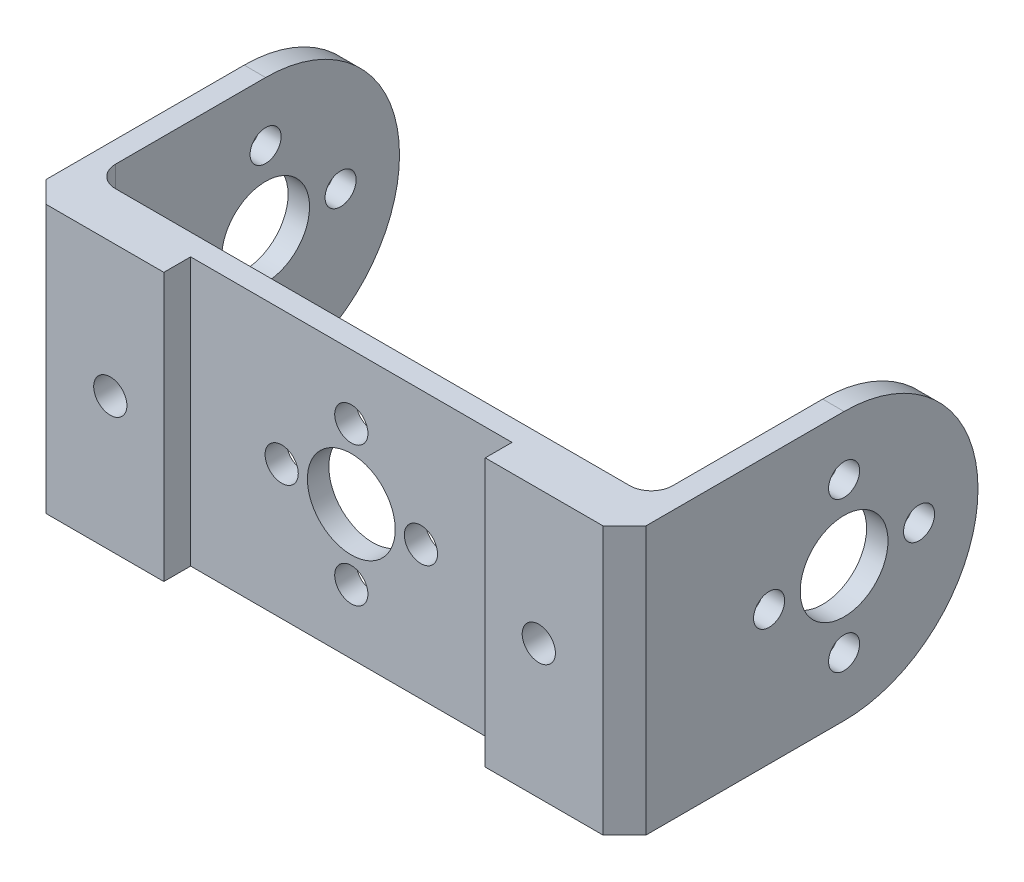
ISO-10303-21;
HEADER;
FILE_DESCRIPTION(('STEP AP214'),'2;1');
FILE_NAME('part.step','',(''),(''),'','','');
FILE_SCHEMA(('AUTOMOTIVE_DESIGN { 1 0 10303 214 1 1 1 1 }'));
ENDSEC;
DATA;
#1=APPLICATION_CONTEXT('core data for automotive mechanical design processes');
#2=APPLICATION_PROTOCOL_DEFINITION('international standard','automotive_design',2000,#1);
#3=PRODUCT_CONTEXT('',#1,'mechanical');
#4=PRODUCT('Part','Part','',(#3));
#5=PRODUCT_RELATED_PRODUCT_CATEGORY('part','',(#4));
#6=PRODUCT_DEFINITION_FORMATION('','',#4);
#7=PRODUCT_DEFINITION_CONTEXT('part definition',#1,'design');
#8=PRODUCT_DEFINITION('design','',#6,#7);
#9=PRODUCT_DEFINITION_SHAPE('','',#8);
#10=(LENGTH_UNIT() NAMED_UNIT(*) SI_UNIT(.MILLI.,.METRE.));
#11=(NAMED_UNIT(*) PLANE_ANGLE_UNIT() SI_UNIT($,.RADIAN.));
#12=(NAMED_UNIT(*) SI_UNIT($,.STERADIAN.) SOLID_ANGLE_UNIT());
#13=UNCERTAINTY_MEASURE_WITH_UNIT(LENGTH_MEASURE(1.E-05),#10,'distance_accuracy_value','');
#14=(GEOMETRIC_REPRESENTATION_CONTEXT(3) GLOBAL_UNCERTAINTY_ASSIGNED_CONTEXT((#13)) GLOBAL_UNIT_ASSIGNED_CONTEXT((#10,
#11,#12)) REPRESENTATION_CONTEXT('',''));
#15=CARTESIAN_POINT('',(0.,0.,0.));
#16=DIRECTION('',(0.,0.,1.));
#17=DIRECTION('',(1.,0.,0.));
#18=AXIS2_PLACEMENT_3D('',#15,#16,#17);
#19=CARTESIAN_POINT('',(0.,0.,2.));
#20=DIRECTION('',(0.,0.,-1.));
#21=DIRECTION('',(-1.,0.,0.));
#22=AXIS2_PLACEMENT_3D('',#19,#20,#21);
#23=PLANE('',#22);
#24=CARTESIAN_POINT('',(0.,6.49999999999998,2.));
#25=DIRECTION('',(0.,0.,1.));
#26=DIRECTION('',(1.,0.,0.));
#27=AXIS2_PLACEMENT_3D('',#24,#25,#26);
#28=CIRCLE('',#27,1.55000000000001);
#29=CARTESIAN_POINT('',(1.55000000000001,6.49999999999998,2.));
#30=VERTEX_POINT('',#29);
#31=EDGE_CURVE('E211',#30,#30,#28,.T.);
#32=ORIENTED_EDGE('',*,*,#31,.F.);
#33=EDGE_LOOP('',(#32));
#34=FACE_BOUND('',#33,.T.);
#35=CARTESIAN_POINT('',(-6.49999999999999,0.,2.));
#36=DIRECTION('',(0.,0.,1.));
#37=DIRECTION('',(1.,0.,0.));
#38=AXIS2_PLACEMENT_3D('',#35,#36,#37);
#39=CIRCLE('',#38,1.54999999999998);
#40=CARTESIAN_POINT('',(-4.95000000000001,0.,2.));
#41=VERTEX_POINT('',#40);
#42=EDGE_CURVE('E230',#41,#41,#39,.T.);
#43=ORIENTED_EDGE('',*,*,#42,.F.);
#44=EDGE_LOOP('',(#43));
#45=FACE_BOUND('',#44,.T.);
#46=CARTESIAN_POINT('',(6.50000000000001,0.,2.));
#47=DIRECTION('',(0.,0.,1.));
#48=DIRECTION('',(1.,0.,0.));
#49=AXIS2_PLACEMENT_3D('',#46,#47,#48);
#50=CIRCLE('',#49,1.54999999999998);
#51=CARTESIAN_POINT('',(8.04999999999999,0.,2.));
#52=VERTEX_POINT('',#51);
#53=EDGE_CURVE('E219',#52,#52,#50,.T.);
#54=ORIENTED_EDGE('',*,*,#53,.F.);
#55=EDGE_LOOP('',(#54));
#56=FACE_BOUND('',#55,.T.);
#57=CARTESIAN_POINT('',(0.,-6.5,2.));
#58=DIRECTION('',(0.,0.,1.));
#59=DIRECTION('',(1.,0.,0.));
#60=AXIS2_PLACEMENT_3D('',#57,#58,#59);
#61=CIRCLE('',#60,1.55000000000001);
#62=CARTESIAN_POINT('',(1.55000000000001,-6.5,2.));
#63=VERTEX_POINT('',#62);
#64=EDGE_CURVE('E220',#63,#63,#61,.T.);
#65=ORIENTED_EDGE('',*,*,#64,.F.);
#66=EDGE_LOOP('',(#65));
#67=FACE_BOUND('',#66,.T.);
#68=CARTESIAN_POINT('',(0.,0.,2.));
#69=DIRECTION('',(0.,0.,1.));
#70=DIRECTION('',(1.,0.,0.));
#71=AXIS2_PLACEMENT_3D('',#68,#69,#70);
#72=CIRCLE('',#71,4.09999999999999);
#73=CARTESIAN_POINT('',(4.09999999999999,0.,2.));
#74=VERTEX_POINT('',#73);
#75=EDGE_CURVE('E210',#74,#74,#72,.T.);
#76=ORIENTED_EDGE('',*,*,#75,.F.);
#77=EDGE_LOOP('',(#76));
#78=FACE_BOUND('',#77,.T.);
#79=DIRECTION('',(0.,-1.,0.));
#80=VECTOR('',#79,1.);
#81=CARTESIAN_POINT('',(15.,12.5,2.));
#82=LINE('',#81,#80);
#83=CARTESIAN_POINT('',(15.,12.5,2.));
#84=VERTEX_POINT('',#83);
#85=CARTESIAN_POINT('',(15.,-12.5,2.));
#86=VERTEX_POINT('',#85);
#87=EDGE_CURVE('E163',#84,#86,#82,.T.);
#88=ORIENTED_EDGE('',*,*,#87,.F.);
#89=DIRECTION('',(-1.,0.,0.));
#90=VECTOR('',#89,1.);
#91=CARTESIAN_POINT('',(-28.,12.5,2.));
#92=LINE('',#91,#90);
#93=CARTESIAN_POINT('',(-15.,12.5,2.));
#94=VERTEX_POINT('',#93);
#95=EDGE_CURVE('E178',#84,#94,#92,.T.);
#96=ORIENTED_EDGE('',*,*,#95,.T.);
#97=DIRECTION('',(0.,1.,0.));
#98=VECTOR('',#97,1.);
#99=CARTESIAN_POINT('',(-15.,12.5,2.));
#100=LINE('',#99,#98);
#101=CARTESIAN_POINT('',(-15.,-12.5,2.));
#102=VERTEX_POINT('',#101);
#103=EDGE_CURVE('E182',#102,#94,#100,.T.);
#104=ORIENTED_EDGE('',*,*,#103,.F.);
#105=DIRECTION('',(1.,0.,0.));
#106=VECTOR('',#105,1.);
#107=CARTESIAN_POINT('',(-28.,-12.5,2.));
#108=LINE('',#107,#106);
#109=EDGE_CURVE('E333',#102,#86,#108,.T.);
#110=ORIENTED_EDGE('',*,*,#109,.T.);
#111=EDGE_LOOP('',(#88,#96,#104,#110));
#112=FACE_BOUND('',#111,.T.);
#113=ADVANCED_FACE('F39',(#34,#45,#56,#67,#78,#112),#23,.F.);
#114=CARTESIAN_POINT('',(0.,0.,0.));
#115=DIRECTION('',(0.,0.,-1.));
#116=DIRECTION('',(-1.,0.,0.));
#117=AXIS2_PLACEMENT_3D('',#114,#115,#116);
#118=PLANE('',#117);
#119=CARTESIAN_POINT('',(-20.,0.,0.));
#120=DIRECTION('',(0.,0.,1.));
#121=DIRECTION('',(1.,0.,0.));
#122=AXIS2_PLACEMENT_3D('',#119,#120,#121);
#123=CIRCLE('',#122,1.54999999999998);
#124=CARTESIAN_POINT('',(-18.45,0.,0.));
#125=VERTEX_POINT('',#124);
#126=EDGE_CURVE('E202',#125,#125,#123,.T.);
#127=ORIENTED_EDGE('',*,*,#126,.T.);
#128=EDGE_LOOP('',(#127));
#129=FACE_BOUND('',#128,.T.);
#130=CARTESIAN_POINT('',(20.,0.,0.));
#131=DIRECTION('',(0.,0.,1.));
#132=DIRECTION('',(1.,0.,0.));
#133=AXIS2_PLACEMENT_3D('',#130,#131,#132);
#134=CIRCLE('',#133,1.54999999999998);
#135=CARTESIAN_POINT('',(21.55,0.,0.));
#136=VERTEX_POINT('',#135);
#137=EDGE_CURVE('E201',#136,#136,#134,.T.);
#138=ORIENTED_EDGE('',*,*,#137,.T.);
#139=EDGE_LOOP('',(#138));
#140=FACE_BOUND('',#139,.T.);
#141=CARTESIAN_POINT('',(0.,6.49999999999998,0.));
#142=DIRECTION('',(0.,0.,1.));
#143=DIRECTION('',(1.,0.,0.));
#144=AXIS2_PLACEMENT_3D('',#141,#142,#143);
#145=CIRCLE('',#144,1.55000000000001);
#146=CARTESIAN_POINT('',(1.55000000000001,6.49999999999998,0.));
#147=VERTEX_POINT('',#146);
#148=EDGE_CURVE('E207',#147,#147,#145,.T.);
#149=ORIENTED_EDGE('',*,*,#148,.T.);
#150=EDGE_LOOP('',(#149));
#151=FACE_BOUND('',#150,.T.);
#152=CARTESIAN_POINT('',(-6.49999999999999,0.,0.));
#153=DIRECTION('',(0.,0.,1.));
#154=DIRECTION('',(1.,0.,0.));
#155=AXIS2_PLACEMENT_3D('',#152,#153,#154);
#156=CIRCLE('',#155,1.54999999999998);
#157=CARTESIAN_POINT('',(-4.95000000000001,0.,0.));
#158=VERTEX_POINT('',#157);
#159=EDGE_CURVE('E206',#158,#158,#156,.T.);
#160=ORIENTED_EDGE('',*,*,#159,.T.);
#161=EDGE_LOOP('',(#160));
#162=FACE_BOUND('',#161,.T.);
#163=CARTESIAN_POINT('',(6.50000000000001,0.,0.));
#164=DIRECTION('',(0.,0.,1.));
#165=DIRECTION('',(1.,0.,0.));
#166=AXIS2_PLACEMENT_3D('',#163,#164,#165);
#167=CIRCLE('',#166,1.54999999999998);
#168=CARTESIAN_POINT('',(8.04999999999999,0.,0.));
#169=VERTEX_POINT('',#168);
#170=EDGE_CURVE('E233',#169,#169,#167,.T.);
#171=ORIENTED_EDGE('',*,*,#170,.T.);
#172=EDGE_LOOP('',(#171));
#173=FACE_BOUND('',#172,.T.);
#174=CARTESIAN_POINT('',(0.,-6.5,0.));
#175=DIRECTION('',(0.,0.,1.));
#176=DIRECTION('',(1.,0.,0.));
#177=AXIS2_PLACEMENT_3D('',#174,#175,#176);
#178=CIRCLE('',#177,1.55000000000001);
#179=CARTESIAN_POINT('',(1.55000000000001,-6.5,0.));
#180=VERTEX_POINT('',#179);
#181=EDGE_CURVE('E216',#180,#180,#178,.T.);
#182=ORIENTED_EDGE('',*,*,#181,.T.);
#183=EDGE_LOOP('',(#182));
#184=FACE_BOUND('',#183,.T.);
#185=CARTESIAN_POINT('',(0.,0.,0.));
#186=DIRECTION('',(0.,0.,1.));
#187=DIRECTION('',(1.,0.,0.));
#188=AXIS2_PLACEMENT_3D('',#185,#186,#187);
#189=CIRCLE('',#188,4.09999999999999);
#190=CARTESIAN_POINT('',(4.09999999999999,0.,0.));
#191=VERTEX_POINT('',#190);
#192=EDGE_CURVE('E223',#191,#191,#189,.T.);
#193=ORIENTED_EDGE('',*,*,#192,.T.);
#194=EDGE_LOOP('',(#193));
#195=FACE_BOUND('',#194,.T.);
#196=DIRECTION('',(-1.,0.,0.));
#197=VECTOR('',#196,1.);
#198=CARTESIAN_POINT('',(-28.,12.5,0.));
#199=LINE('',#198,#197);
#200=CARTESIAN_POINT('',(24.,12.5,0.));
#201=VERTEX_POINT('',#200);
#202=CARTESIAN_POINT('',(-24.,12.5,0.));
#203=VERTEX_POINT('',#202);
#204=EDGE_CURVE('E329',#201,#203,#199,.T.);
#205=ORIENTED_EDGE('',*,*,#204,.F.);
#206=DIRECTION('',(0.,1.,0.));
#207=VECTOR('',#206,1.);
#208=CARTESIAN_POINT('',(24.,0.,0.));
#209=LINE('',#208,#207);
#210=CARTESIAN_POINT('',(24.,-12.5,0.));
#211=VERTEX_POINT('',#210);
#212=EDGE_CURVE('E354',#201,#211,#209,.F.);
#213=ORIENTED_EDGE('',*,*,#212,.T.);
#214=DIRECTION('',(1.,0.,0.));
#215=VECTOR('',#214,1.);
#216=CARTESIAN_POINT('',(-28.,-12.5,0.));
#217=LINE('',#216,#215);
#218=CARTESIAN_POINT('',(-24.,-12.5,0.));
#219=VERTEX_POINT('',#218);
#220=EDGE_CURVE('E334',#219,#211,#217,.T.);
#221=ORIENTED_EDGE('',*,*,#220,.F.);
#222=DIRECTION('',(0.,1.,0.));
#223=VECTOR('',#222,1.);
#224=CARTESIAN_POINT('',(-24.,0.,0.));
#225=LINE('',#224,#223);
#226=EDGE_CURVE('E351',#219,#203,#225,.T.);
#227=ORIENTED_EDGE('',*,*,#226,.T.);
#228=EDGE_LOOP('',(#205,#213,#221,#227));
#229=FACE_BOUND('',#228,.T.);
#230=ADVANCED_FACE('F410',(#129,#140,#151,#162,#173,#184,#195,#229),#118,.T.);
#231=CARTESIAN_POINT('',(28.,-12.5,2.));
#232=DIRECTION('',(-1.,0.,0.));
#233=DIRECTION('',(0.,0.,1.));
#234=AXIS2_PLACEMENT_3D('',#231,#232,#233);
#235=PLANE('',#234);
#236=DIRECTION('',(0.,0.,-1.));
#237=VECTOR('',#236,1.);
#238=CARTESIAN_POINT('',(28.,12.5,2.));
#239=LINE('',#238,#237);
#240=CARTESIAN_POINT('',(28.,12.5,2.49999999999999));
#241=VERTEX_POINT('',#240);
#242=CARTESIAN_POINT('',(28.,12.5,-16.));
#243=VERTEX_POINT('',#242);
#244=EDGE_CURVE('E346',#241,#243,#239,.T.);
#245=ORIENTED_EDGE('',*,*,#244,.F.);
#246=DIRECTION('',(0.,-1.,0.));
#247=VECTOR('',#246,1.);
#248=CARTESIAN_POINT('',(28.,-12.5,2.49999999999999));
#249=LINE('',#248,#247);
#250=CARTESIAN_POINT('',(28.,-12.5,2.49999999999999));
#251=VERTEX_POINT('',#250);
#252=EDGE_CURVE('E371',#241,#251,#249,.T.);
#253=ORIENTED_EDGE('',*,*,#252,.T.);
#254=DIRECTION('',(0.,0.,-1.));
#255=VECTOR('',#254,1.);
#256=CARTESIAN_POINT('',(28.,-12.5,2.));
#257=LINE('',#256,#255);
#258=CARTESIAN_POINT('',(28.,-12.5,-16.));
#259=VERTEX_POINT('',#258);
#260=EDGE_CURVE('E336',#251,#259,#257,.T.);
#261=ORIENTED_EDGE('',*,*,#260,.T.);
#262=CARTESIAN_POINT('',(28.,0.,-16.));
#263=DIRECTION('',(1.,0.,0.));
#264=DIRECTION('',(0.,0.,-1.));
#265=AXIS2_PLACEMENT_3D('',#262,#263,#264);
#266=CIRCLE('',#265,12.5);
#267=EDGE_CURVE('E282',#259,#243,#266,.T.);
#268=ORIENTED_EDGE('',*,*,#267,.T.);
#269=EDGE_LOOP('',(#245,#253,#261,#268));
#270=FACE_BOUND('',#269,.T.);
#271=CARTESIAN_POINT('',(28.,0.,-23.));
#272=DIRECTION('',(1.,0.,0.));
#273=DIRECTION('',(0.,0.,-1.));
#274=AXIS2_PLACEMENT_3D('',#271,#272,#273);
#275=CIRCLE('',#274,1.45);
#276=CARTESIAN_POINT('',(28.,0.,-24.45));
#277=VERTEX_POINT('',#276);
#278=EDGE_CURVE('E312',#277,#277,#275,.F.);
#279=ORIENTED_EDGE('',*,*,#278,.T.);
#280=EDGE_LOOP('',(#279));
#281=FACE_BOUND('',#280,.T.);
#282=CARTESIAN_POINT('',(28.,0.,-16.));
#283=DIRECTION('',(1.,0.,0.));
#284=DIRECTION('',(0.,0.,-1.));
#285=AXIS2_PLACEMENT_3D('',#282,#283,#284);
#286=CIRCLE('',#285,4.10000000000005);
#287=CARTESIAN_POINT('',(28.,0.,-20.1));
#288=VERTEX_POINT('',#287);
#289=EDGE_CURVE('E315',#288,#288,#286,.T.);
#290=ORIENTED_EDGE('',*,*,#289,.F.);
#291=EDGE_LOOP('',(#290));
#292=FACE_BOUND('',#291,.T.);
#293=CARTESIAN_POINT('',(28.,6.99999999999998,-16.));
#294=DIRECTION('',(1.,0.,0.));
#295=DIRECTION('',(0.,0.,-1.));
#296=AXIS2_PLACEMENT_3D('',#293,#294,#295);
#297=CIRCLE('',#296,1.45);
#298=CARTESIAN_POINT('',(28.,6.99999999999998,-17.45));
#299=VERTEX_POINT('',#298);
#300=EDGE_CURVE('E318',#299,#299,#297,.T.);
#301=ORIENTED_EDGE('',*,*,#300,.F.);
#302=EDGE_LOOP('',(#301));
#303=FACE_BOUND('',#302,.T.);
#304=CARTESIAN_POINT('',(28.,0.,-8.99999999999999));
#305=DIRECTION('',(1.,0.,0.));
#306=DIRECTION('',(0.,0.,-1.));
#307=AXIS2_PLACEMENT_3D('',#304,#305,#306);
#308=CIRCLE('',#307,1.45);
#309=CARTESIAN_POINT('',(28.,0.,-10.45));
#310=VERTEX_POINT('',#309);
#311=EDGE_CURVE('E321',#310,#310,#308,.F.);
#312=ORIENTED_EDGE('',*,*,#311,.T.);
#313=EDGE_LOOP('',(#312));
#314=FACE_BOUND('',#313,.T.);
#315=CARTESIAN_POINT('',(28.,-7.00000000000001,-16.));
#316=DIRECTION('',(1.,0.,0.));
#317=DIRECTION('',(0.,0.,-1.));
#318=AXIS2_PLACEMENT_3D('',#315,#316,#317);
#319=CIRCLE('',#318,1.45);
#320=CARTESIAN_POINT('',(28.,-7.00000000000001,-17.45));
#321=VERTEX_POINT('',#320);
#322=EDGE_CURVE('E289',#321,#321,#319,.T.);
#323=ORIENTED_EDGE('',*,*,#322,.F.);
#324=EDGE_LOOP('',(#323));
#325=FACE_BOUND('',#324,.T.);
#326=ADVANCED_FACE('F429',(#270,#281,#292,#303,#314,#325),#235,.F.);
#327=CARTESIAN_POINT('',(-28.,12.5,2.));
#328=DIRECTION('',(0.,-1.,0.));
#329=DIRECTION('',(0.,0.,-1.));
#330=AXIS2_PLACEMENT_3D('',#327,#328,#329);
#331=PLANE('',#330);
#332=DIRECTION('',(-1.,0.,0.));
#333=VECTOR('',#332,1.);
#334=CARTESIAN_POINT('',(28.,12.5,4.5));
#335=LINE('',#334,#333);
#336=CARTESIAN_POINT('',(26.,12.5,4.5));
#337=VERTEX_POINT('',#336);
#338=CARTESIAN_POINT('',(15.,12.5,4.5));
#339=VERTEX_POINT('',#338);
#340=EDGE_CURVE('E152',#337,#339,#335,.T.);
#341=ORIENTED_EDGE('',*,*,#340,.F.);
#342=DIRECTION('',(0.707106781186546,0.,-0.707106781186549));
#343=VECTOR('',#342,1.);
#344=CARTESIAN_POINT('',(26.,12.5,4.5));
#345=LINE('',#344,#343);
#346=EDGE_CURVE('E369',#337,#241,#345,.T.);
#347=ORIENTED_EDGE('',*,*,#346,.T.);
#348=ORIENTED_EDGE('',*,*,#244,.T.);
#349=DIRECTION('',(1.,0.,0.));
#350=VECTOR('',#349,1.);
#351=CARTESIAN_POINT('',(26.,12.5,-16.));
#352=LINE('',#351,#350);
#353=CARTESIAN_POINT('',(26.,12.5,-16.));
#354=VERTEX_POINT('',#353);
#355=EDGE_CURVE('E326',#354,#243,#352,.T.);
#356=ORIENTED_EDGE('',*,*,#355,.F.);
#357=DIRECTION('',(0.,0.,-1.));
#358=VECTOR('',#357,1.);
#359=CARTESIAN_POINT('',(26.,12.5,0.));
#360=LINE('',#359,#358);
#361=CARTESIAN_POINT('',(26.,12.5,-2.));
#362=VERTEX_POINT('',#361);
#363=EDGE_CURVE('E292',#362,#354,#360,.T.);
#364=ORIENTED_EDGE('',*,*,#363,.F.);
#365=CARTESIAN_POINT('',(24.,12.5,-2.));
#366=DIRECTION('',(0.,-1.,0.));
#367=DIRECTION('',(0.,0.,-1.));
#368=AXIS2_PLACEMENT_3D('',#365,#366,#367);
#369=CIRCLE('',#368,2.);
#370=EDGE_CURVE('E358',#362,#201,#369,.T.);
#371=ORIENTED_EDGE('',*,*,#370,.T.);
#372=ORIENTED_EDGE('',*,*,#204,.T.);
#373=CARTESIAN_POINT('',(-24.,12.5,-2.));
#374=DIRECTION('',(0.,-1.,0.));
#375=DIRECTION('',(0.,0.,-1.));
#376=AXIS2_PLACEMENT_3D('',#373,#374,#375);
#377=CIRCLE('',#376,2.);
#378=CARTESIAN_POINT('',(-26.,12.5,-2.));
#379=VERTEX_POINT('',#378);
#380=EDGE_CURVE('E362',#203,#379,#377,.T.);
#381=ORIENTED_EDGE('',*,*,#380,.T.);
#382=DIRECTION('',(0.,0.,-1.));
#383=VECTOR('',#382,1.);
#384=CARTESIAN_POINT('',(-26.,12.5,0.));
#385=LINE('',#384,#383);
#386=CARTESIAN_POINT('',(-26.,12.5,-16.));
#387=VERTEX_POINT('',#386);
#388=EDGE_CURVE('E241',#379,#387,#385,.T.);
#389=ORIENTED_EDGE('',*,*,#388,.T.);
#390=DIRECTION('',(-1.,0.,0.));
#391=VECTOR('',#390,1.);
#392=CARTESIAN_POINT('',(-26.,12.5,-16.));
#393=LINE('',#392,#391);
#394=CARTESIAN_POINT('',(-28.,12.5,-16.));
#395=VERTEX_POINT('',#394);
#396=EDGE_CURVE('E262',#387,#395,#393,.T.);
#397=ORIENTED_EDGE('',*,*,#396,.T.);
#398=DIRECTION('',(0.,0.,-1.));
#399=VECTOR('',#398,1.);
#400=CARTESIAN_POINT('',(-28.,12.5,2.));
#401=LINE('',#400,#399);
#402=CARTESIAN_POINT('',(-28.,12.5,2.49999999999999));
#403=VERTEX_POINT('',#402);
#404=EDGE_CURVE('E344',#403,#395,#401,.T.);
#405=ORIENTED_EDGE('',*,*,#404,.F.);
#406=DIRECTION('',(0.707106781186546,0.,0.707106781186549));
#407=VECTOR('',#406,1.);
#408=CARTESIAN_POINT('',(-26.,12.5,4.5));
#409=LINE('',#408,#407);
#410=CARTESIAN_POINT('',(-26.,12.5,4.5));
#411=VERTEX_POINT('',#410);
#412=EDGE_CURVE('E367',#403,#411,#409,.T.);
#413=ORIENTED_EDGE('',*,*,#412,.T.);
#414=DIRECTION('',(-1.,0.,0.));
#415=VECTOR('',#414,1.);
#416=CARTESIAN_POINT('',(-28.,12.5,4.5));
#417=LINE('',#416,#415);
#418=CARTESIAN_POINT('',(-15.,12.5,4.5));
#419=VERTEX_POINT('',#418);
#420=EDGE_CURVE('E191',#419,#411,#417,.T.);
#421=ORIENTED_EDGE('',*,*,#420,.F.);
#422=DIRECTION('',(0.,0.,-1.));
#423=VECTOR('',#422,1.);
#424=CARTESIAN_POINT('',(-15.,12.5,4.5));
#425=LINE('',#424,#423);
#426=EDGE_CURVE('E194',#419,#94,#425,.T.);
#427=ORIENTED_EDGE('',*,*,#426,.T.);
#428=ORIENTED_EDGE('',*,*,#95,.F.);
#429=DIRECTION('',(0.,0.,-1.));
#430=VECTOR('',#429,1.);
#431=CARTESIAN_POINT('',(15.,12.5,4.5));
#432=LINE('',#431,#430);
#433=EDGE_CURVE('E169',#339,#84,#432,.T.);
#434=ORIENTED_EDGE('',*,*,#433,.F.);
#435=EDGE_LOOP('',(#341,#347,#348,#356,#364,#371,#372,#381,#389,#397,#405,#413,#421,#427,#428,#434));
#436=FACE_BOUND('',#435,.T.);
#437=ADVANCED_FACE('F176',(#436),#331,.F.);
#438=CARTESIAN_POINT('',(-28.,-12.5,2.));
#439=DIRECTION('',(1.,0.,0.));
#440=DIRECTION('',(0.,0.,-1.));
#441=AXIS2_PLACEMENT_3D('',#438,#439,#440);
#442=PLANE('',#441);
#443=DIRECTION('',(0.,0.,-1.));
#444=VECTOR('',#443,1.);
#445=CARTESIAN_POINT('',(-28.,-12.5,2.));
#446=LINE('',#445,#444);
#447=CARTESIAN_POINT('',(-28.,-12.5,2.49999999999999));
#448=VERTEX_POINT('',#447);
#449=CARTESIAN_POINT('',(-28.,-12.5,-16.));
#450=VERTEX_POINT('',#449);
#451=EDGE_CURVE('E342',#448,#450,#446,.T.);
#452=ORIENTED_EDGE('',*,*,#451,.F.);
#453=DIRECTION('',(0.,1.,0.));
#454=VECTOR('',#453,1.);
#455=CARTESIAN_POINT('',(-28.,12.5,2.49999999999999));
#456=LINE('',#455,#454);
#457=EDGE_CURVE('E11',#448,#403,#456,.T.);
#458=ORIENTED_EDGE('',*,*,#457,.T.);
#459=ORIENTED_EDGE('',*,*,#404,.T.);
#460=CARTESIAN_POINT('',(-28.,0.,-16.));
#461=DIRECTION('',(1.,0.,0.));
#462=DIRECTION('',(0.,0.,-1.));
#463=AXIS2_PLACEMENT_3D('',#460,#461,#462);
#464=CIRCLE('',#463,12.5);
#465=EDGE_CURVE('E205',#450,#395,#464,.T.);
#466=ORIENTED_EDGE('',*,*,#465,.F.);
#467=EDGE_LOOP('',(#452,#458,#459,#466));
#468=FACE_BOUND('',#467,.T.);
#469=CARTESIAN_POINT('',(-28.,0.,-23.));
#470=DIRECTION('',(1.,0.,0.));
#471=DIRECTION('',(0.,0.,-1.));
#472=AXIS2_PLACEMENT_3D('',#469,#470,#471);
#473=CIRCLE('',#472,1.45);
#474=CARTESIAN_POINT('',(-28.,0.,-24.45));
#475=VERTEX_POINT('',#474);
#476=EDGE_CURVE('E265',#475,#475,#473,.F.);
#477=ORIENTED_EDGE('',*,*,#476,.F.);
#478=EDGE_LOOP('',(#477));
#479=FACE_BOUND('',#478,.T.);
#480=CARTESIAN_POINT('',(-28.,0.,-16.));
#481=DIRECTION('',(1.,0.,0.));
#482=DIRECTION('',(0.,0.,-1.));
#483=AXIS2_PLACEMENT_3D('',#480,#481,#482);
#484=CIRCLE('',#483,4.10000000000005);
#485=CARTESIAN_POINT('',(-28.,0.,-20.1));
#486=VERTEX_POINT('',#485);
#487=EDGE_CURVE('E268',#486,#486,#484,.T.);
#488=ORIENTED_EDGE('',*,*,#487,.T.);
#489=EDGE_LOOP('',(#488));
#490=FACE_BOUND('',#489,.T.);
#491=CARTESIAN_POINT('',(-28.,6.99999999999998,-16.));
#492=DIRECTION('',(1.,0.,0.));
#493=DIRECTION('',(0.,0.,-1.));
#494=AXIS2_PLACEMENT_3D('',#491,#492,#493);
#495=CIRCLE('',#494,1.45);
#496=CARTESIAN_POINT('',(-28.,6.99999999999998,-17.45));
#497=VERTEX_POINT('',#496);
#498=EDGE_CURVE('E271',#497,#497,#495,.T.);
#499=ORIENTED_EDGE('',*,*,#498,.T.);
#500=EDGE_LOOP('',(#499));
#501=FACE_BOUND('',#500,.T.);
#502=CARTESIAN_POINT('',(-28.,0.,-8.99999999999999));
#503=DIRECTION('',(1.,0.,0.));
#504=DIRECTION('',(0.,0.,-1.));
#505=AXIS2_PLACEMENT_3D('',#502,#503,#504);
#506=CIRCLE('',#505,1.45);
#507=CARTESIAN_POINT('',(-28.,0.,-10.45));
#508=VERTEX_POINT('',#507);
#509=EDGE_CURVE('E274',#508,#508,#506,.F.);
#510=ORIENTED_EDGE('',*,*,#509,.F.);
#511=EDGE_LOOP('',(#510));
#512=FACE_BOUND('',#511,.T.);
#513=CARTESIAN_POINT('',(-28.,-7.00000000000001,-16.));
#514=DIRECTION('',(1.,0.,0.));
#515=DIRECTION('',(0.,0.,-1.));
#516=AXIS2_PLACEMENT_3D('',#513,#514,#515);
#517=CIRCLE('',#516,1.45);
#518=CARTESIAN_POINT('',(-28.,-7.00000000000001,-17.45));
#519=VERTEX_POINT('',#518);
#520=EDGE_CURVE('E242',#519,#519,#517,.T.);
#521=ORIENTED_EDGE('',*,*,#520,.T.);
#522=EDGE_LOOP('',(#521));
#523=FACE_BOUND('',#522,.T.);
#524=ADVANCED_FACE('F390',(#468,#479,#490,#501,#512,#523),#442,.F.);
#525=CARTESIAN_POINT('',(-28.,-12.5,2.));
#526=DIRECTION('',(0.,1.,0.));
#527=DIRECTION('',(0.,0.,1.));
#528=AXIS2_PLACEMENT_3D('',#525,#526,#527);
#529=PLANE('',#528);
#530=ORIENTED_EDGE('',*,*,#260,.F.);
#531=DIRECTION('',(-0.707106781186546,0.,0.707106781186549));
#532=VECTOR('',#531,1.);
#533=CARTESIAN_POINT('',(26.,-12.5,4.5));
#534=LINE('',#533,#532);
#535=CARTESIAN_POINT('',(26.,-12.5,4.5));
#536=VERTEX_POINT('',#535);
#537=EDGE_CURVE('E374',#251,#536,#534,.T.);
#538=ORIENTED_EDGE('',*,*,#537,.T.);
#539=DIRECTION('',(1.,0.,0.));
#540=VECTOR('',#539,1.);
#541=CARTESIAN_POINT('',(28.,-12.5,4.5));
#542=LINE('',#541,#540);
#543=CARTESIAN_POINT('',(15.,-12.5,4.5));
#544=VERTEX_POINT('',#543);
#545=EDGE_CURVE('E173',#544,#536,#542,.T.);
#546=ORIENTED_EDGE('',*,*,#545,.F.);
#547=DIRECTION('',(0.,0.,-1.));
#548=VECTOR('',#547,1.);
#549=CARTESIAN_POINT('',(15.,-12.5,4.5));
#550=LINE('',#549,#548);
#551=EDGE_CURVE('E171',#544,#86,#550,.T.);
#552=ORIENTED_EDGE('',*,*,#551,.T.);
#553=ORIENTED_EDGE('',*,*,#109,.F.);
#554=DIRECTION('',(0.,0.,-1.));
#555=VECTOR('',#554,1.);
#556=CARTESIAN_POINT('',(-15.,-12.5,4.5));
#557=LINE('',#556,#555);
#558=CARTESIAN_POINT('',(-15.,-12.5,4.5));
#559=VERTEX_POINT('',#558);
#560=EDGE_CURVE('E198',#559,#102,#557,.T.);
#561=ORIENTED_EDGE('',*,*,#560,.F.);
#562=DIRECTION('',(1.,0.,0.));
#563=VECTOR('',#562,1.);
#564=CARTESIAN_POINT('',(-28.,-12.5,4.5));
#565=LINE('',#564,#563);
#566=CARTESIAN_POINT('',(-26.,-12.5,4.5));
#567=VERTEX_POINT('',#566);
#568=EDGE_CURVE('E187',#567,#559,#565,.T.);
#569=ORIENTED_EDGE('',*,*,#568,.F.);
#570=DIRECTION('',(-0.707106781186546,0.,-0.707106781186549));
#571=VECTOR('',#570,1.);
#572=CARTESIAN_POINT('',(-26.,-12.5,4.5));
#573=LINE('',#572,#571);
#574=EDGE_CURVE('E55',#567,#448,#573,.T.);
#575=ORIENTED_EDGE('',*,*,#574,.T.);
#576=ORIENTED_EDGE('',*,*,#451,.T.);
#577=DIRECTION('',(-1.,0.,0.));
#578=VECTOR('',#577,1.);
#579=CARTESIAN_POINT('',(-26.,-12.5,-16.));
#580=LINE('',#579,#578);
#581=CARTESIAN_POINT('',(-26.,-12.5,-16.));
#582=VERTEX_POINT('',#581);
#583=EDGE_CURVE('E279',#582,#450,#580,.T.);
#584=ORIENTED_EDGE('',*,*,#583,.F.);
#585=DIRECTION('',(0.,0.,1.));
#586=VECTOR('',#585,1.);
#587=CARTESIAN_POINT('',(-26.,-12.5,0.));
#588=LINE('',#587,#586);
#589=CARTESIAN_POINT('',(-26.,-12.5,-2.));
#590=VERTEX_POINT('',#589);
#591=EDGE_CURVE('E238',#582,#590,#588,.T.);
#592=ORIENTED_EDGE('',*,*,#591,.T.);
#593=CARTESIAN_POINT('',(-24.,-12.5,-2.));
#594=DIRECTION('',(0.,1.,0.));
#595=DIRECTION('',(0.,0.,1.));
#596=AXIS2_PLACEMENT_3D('',#593,#594,#595);
#597=CIRCLE('',#596,2.);
#598=EDGE_CURVE('E364',#590,#219,#597,.T.);
#599=ORIENTED_EDGE('',*,*,#598,.T.);
#600=ORIENTED_EDGE('',*,*,#220,.T.);
#601=CARTESIAN_POINT('',(24.,-12.5,-2.));
#602=DIRECTION('',(0.,1.,0.));
#603=DIRECTION('',(0.,0.,1.));
#604=AXIS2_PLACEMENT_3D('',#601,#602,#603);
#605=CIRCLE('',#604,2.);
#606=CARTESIAN_POINT('',(26.,-12.5,-2.));
#607=VERTEX_POINT('',#606);
#608=EDGE_CURVE('E360',#211,#607,#605,.T.);
#609=ORIENTED_EDGE('',*,*,#608,.T.);
#610=DIRECTION('',(0.,0.,1.));
#611=VECTOR('',#610,1.);
#612=CARTESIAN_POINT('',(26.,-12.5,0.));
#613=LINE('',#612,#611);
#614=CARTESIAN_POINT('',(26.,-12.5,-16.));
#615=VERTEX_POINT('',#614);
#616=EDGE_CURVE('E285',#615,#607,#613,.T.);
#617=ORIENTED_EDGE('',*,*,#616,.F.);
#618=DIRECTION('',(1.,0.,0.));
#619=VECTOR('',#618,1.);
#620=CARTESIAN_POINT('',(26.,-12.5,-16.));
#621=LINE('',#620,#619);
#622=EDGE_CURVE('E309',#615,#259,#621,.T.);
#623=ORIENTED_EDGE('',*,*,#622,.T.);
#624=EDGE_LOOP('',(#530,#538,#546,#552,#553,#561,#569,#575,#576,#584,#592,#599,#600,#609,#617,#623));
#625=FACE_BOUND('',#624,.T.);
#626=ADVANCED_FACE('F382',(#625),#529,.F.);
#627=CARTESIAN_POINT('',(26.,0.,-8.99999999999999));
#628=DIRECTION('',(1.,0.,0.));
#629=DIRECTION('',(0.,0.,-1.));
#630=AXIS2_PLACEMENT_3D('',#627,#628,#629);
#631=CYLINDRICAL_SURFACE('',#630,1.45);
#632=CARTESIAN_POINT('',(26.,0.,-8.99999999999999));
#633=DIRECTION('',(1.,0.,0.));
#634=DIRECTION('',(0.,0.,-1.));
#635=AXIS2_PLACEMENT_3D('',#632,#633,#634);
#636=CIRCLE('',#635,1.45);
#637=CARTESIAN_POINT('',(26.,0.,-10.45));
#638=VERTEX_POINT('',#637);
#639=EDGE_CURVE('E303',#638,#638,#636,.F.);
#640=ORIENTED_EDGE('',*,*,#639,.T.);
#641=EDGE_LOOP('',(#640));
#642=FACE_BOUND('',#641,.T.);
#643=ORIENTED_EDGE('',*,*,#311,.F.);
#644=EDGE_LOOP('',(#643));
#645=FACE_BOUND('',#644,.T.);
#646=ADVANCED_FACE('F464',(#642,#645),#631,.F.);
#647=CARTESIAN_POINT('',(26.,6.99999999999998,-16.));
#648=DIRECTION('',(1.,0.,0.));
#649=DIRECTION('',(0.,0.,-1.));
#650=AXIS2_PLACEMENT_3D('',#647,#648,#649);
#651=CYLINDRICAL_SURFACE('',#650,1.45);
#652=CARTESIAN_POINT('',(26.,6.99999999999998,-16.));
#653=DIRECTION('',(1.,0.,0.));
#654=DIRECTION('',(0.,0.,-1.));
#655=AXIS2_PLACEMENT_3D('',#652,#653,#654);
#656=CIRCLE('',#655,1.45);
#657=CARTESIAN_POINT('',(26.,6.99999999999998,-17.45));
#658=VERTEX_POINT('',#657);
#659=EDGE_CURVE('E300',#658,#658,#656,.T.);
#660=ORIENTED_EDGE('',*,*,#659,.F.);
#661=EDGE_LOOP('',(#660));
#662=FACE_BOUND('',#661,.T.);
#663=ORIENTED_EDGE('',*,*,#300,.T.);
#664=EDGE_LOOP('',(#663));
#665=FACE_BOUND('',#664,.T.);
#666=ADVANCED_FACE('F745',(#662,#665),#651,.F.);
#667=CARTESIAN_POINT('',(26.,0.,-16.));
#668=DIRECTION('',(1.,0.,0.));
#669=DIRECTION('',(0.,0.,-1.));
#670=AXIS2_PLACEMENT_3D('',#667,#668,#669);
#671=CYLINDRICAL_SURFACE('',#670,4.10000000000005);
#672=CARTESIAN_POINT('',(26.,0.,-16.));
#673=DIRECTION('',(1.,0.,0.));
#674=DIRECTION('',(0.,0.,-1.));
#675=AXIS2_PLACEMENT_3D('',#672,#673,#674);
#676=CIRCLE('',#675,4.10000000000005);
#677=CARTESIAN_POINT('',(26.,0.,-20.1));
#678=VERTEX_POINT('',#677);
#679=EDGE_CURVE('E297',#678,#678,#676,.T.);
#680=ORIENTED_EDGE('',*,*,#679,.F.);
#681=EDGE_LOOP('',(#680));
#682=FACE_BOUND('',#681,.T.);
#683=ORIENTED_EDGE('',*,*,#289,.T.);
#684=EDGE_LOOP('',(#683));
#685=FACE_BOUND('',#684,.T.);
#686=ADVANCED_FACE('F736',(#682,#685),#671,.F.);
#687=CARTESIAN_POINT('',(26.,0.,-23.));
#688=DIRECTION('',(1.,0.,0.));
#689=DIRECTION('',(0.,0.,-1.));
#690=AXIS2_PLACEMENT_3D('',#687,#688,#689);
#691=CYLINDRICAL_SURFACE('',#690,1.45);
#692=CARTESIAN_POINT('',(26.,0.,-23.));
#693=DIRECTION('',(1.,0.,0.));
#694=DIRECTION('',(0.,0.,-1.));
#695=AXIS2_PLACEMENT_3D('',#692,#693,#694);
#696=CIRCLE('',#695,1.45);
#697=CARTESIAN_POINT('',(26.,0.,-24.45));
#698=VERTEX_POINT('',#697);
#699=EDGE_CURVE('E294',#698,#698,#696,.F.);
#700=ORIENTED_EDGE('',*,*,#699,.T.);
#701=EDGE_LOOP('',(#700));
#702=FACE_BOUND('',#701,.T.);
#703=ORIENTED_EDGE('',*,*,#278,.F.);
#704=EDGE_LOOP('',(#703));
#705=FACE_BOUND('',#704,.T.);
#706=ADVANCED_FACE('F728',(#702,#705),#691,.F.);
#707=CARTESIAN_POINT('',(26.,0.,-16.));
#708=DIRECTION('',(1.,0.,0.));
#709=DIRECTION('',(0.,0.,-1.));
#710=AXIS2_PLACEMENT_3D('',#707,#708,#709);
#711=CYLINDRICAL_SURFACE('',#710,12.5);
#712=ORIENTED_EDGE('',*,*,#267,.F.);
#713=ORIENTED_EDGE('',*,*,#622,.F.);
#714=CARTESIAN_POINT('',(26.,0.,-16.));
#715=DIRECTION('',(1.,0.,0.));
#716=DIRECTION('',(0.,0.,-1.));
#717=AXIS2_PLACEMENT_3D('',#714,#715,#716);
#718=CIRCLE('',#717,12.5);
#719=EDGE_CURVE('E288',#615,#354,#718,.T.);
#720=ORIENTED_EDGE('',*,*,#719,.T.);
#721=ORIENTED_EDGE('',*,*,#355,.T.);
#722=EDGE_LOOP('',(#712,#713,#720,#721));
#723=FACE_BOUND('',#722,.T.);
#724=ADVANCED_FACE('F426',(#723),#711,.T.);
#725=CARTESIAN_POINT('',(26.,-7.00000000000001,-16.));
#726=DIRECTION('',(1.,0.,0.));
#727=DIRECTION('',(0.,0.,-1.));
#728=AXIS2_PLACEMENT_3D('',#725,#726,#727);
#729=CYLINDRICAL_SURFACE('',#728,1.45);
#730=CARTESIAN_POINT('',(26.,-7.00000000000001,-16.));
#731=DIRECTION('',(1.,0.,0.));
#732=DIRECTION('',(0.,0.,-1.));
#733=AXIS2_PLACEMENT_3D('',#730,#731,#732);
#734=CIRCLE('',#733,1.45);
#735=CARTESIAN_POINT('',(26.,-7.00000000000001,-17.45));
#736=VERTEX_POINT('',#735);
#737=EDGE_CURVE('E306',#736,#736,#734,.T.);
#738=ORIENTED_EDGE('',*,*,#737,.F.);
#739=EDGE_LOOP('',(#738));
#740=FACE_BOUND('',#739,.T.);
#741=ORIENTED_EDGE('',*,*,#322,.T.);
#742=EDGE_LOOP('',(#741));
#743=FACE_BOUND('',#742,.T.);
#744=ADVANCED_FACE('F602',(#740,#743),#729,.F.);
#745=CARTESIAN_POINT('',(26.,0.,0.));
#746=DIRECTION('',(1.,0.,0.));
#747=DIRECTION('',(0.,0.,-1.));
#748=AXIS2_PLACEMENT_3D('',#745,#746,#747);
#749=PLANE('',#748);
#750=ORIENTED_EDGE('',*,*,#616,.T.);
#751=DIRECTION('',(0.,1.,0.));
#752=VECTOR('',#751,1.);
#753=CARTESIAN_POINT('',(26.,0.,-2.));
#754=LINE('',#753,#752);
#755=EDGE_CURVE('E348',#607,#362,#754,.T.);
#756=ORIENTED_EDGE('',*,*,#755,.T.);
#757=ORIENTED_EDGE('',*,*,#363,.T.);
#758=ORIENTED_EDGE('',*,*,#719,.F.);
#759=EDGE_LOOP('',(#750,#756,#757,#758));
#760=FACE_BOUND('',#759,.T.);
#761=ORIENTED_EDGE('',*,*,#699,.F.);
#762=EDGE_LOOP('',(#761));
#763=FACE_BOUND('',#762,.T.);
#764=ORIENTED_EDGE('',*,*,#679,.T.);
#765=EDGE_LOOP('',(#764));
#766=FACE_BOUND('',#765,.T.);
#767=ORIENTED_EDGE('',*,*,#659,.T.);
#768=EDGE_LOOP('',(#767));
#769=FACE_BOUND('',#768,.T.);
#770=ORIENTED_EDGE('',*,*,#639,.F.);
#771=EDGE_LOOP('',(#770));
#772=FACE_BOUND('',#771,.T.);
#773=ORIENTED_EDGE('',*,*,#737,.T.);
#774=EDGE_LOOP('',(#773));
#775=FACE_BOUND('',#774,.T.);
#776=ADVANCED_FACE('F419',(#760,#763,#766,#769,#772,#775),#749,.F.);
#777=CARTESIAN_POINT('',(-26.,0.,-16.));
#778=DIRECTION('',(-1.,0.,0.));
#779=DIRECTION('',(0.,0.,1.));
#780=AXIS2_PLACEMENT_3D('',#777,#778,#779);
#781=CYLINDRICAL_SURFACE('',#780,12.5);
#782=ORIENTED_EDGE('',*,*,#465,.T.);
#783=ORIENTED_EDGE('',*,*,#396,.F.);
#784=CARTESIAN_POINT('',(-26.,0.,-16.));
#785=DIRECTION('',(1.,0.,0.));
#786=DIRECTION('',(0.,0.,-1.));
#787=AXIS2_PLACEMENT_3D('',#784,#785,#786);
#788=CIRCLE('',#787,12.5);
#789=EDGE_CURVE('E244',#582,#387,#788,.T.);
#790=ORIENTED_EDGE('',*,*,#789,.F.);
#791=ORIENTED_EDGE('',*,*,#583,.T.);
#792=EDGE_LOOP('',(#782,#783,#790,#791));
#793=FACE_BOUND('',#792,.T.);
#794=ADVANCED_FACE('F395',(#793),#781,.T.);
#795=CARTESIAN_POINT('',(-26.,0.,-8.99999999999999));
#796=DIRECTION('',(-1.,0.,0.));
#797=DIRECTION('',(0.,0.,1.));
#798=AXIS2_PLACEMENT_3D('',#795,#796,#797);
#799=CYLINDRICAL_SURFACE('',#798,1.45);
#800=CARTESIAN_POINT('',(-26.,0.,-8.99999999999999));
#801=DIRECTION('',(1.,0.,0.));
#802=DIRECTION('',(0.,0.,-1.));
#803=AXIS2_PLACEMENT_3D('',#800,#801,#802);
#804=CIRCLE('',#803,1.45);
#805=CARTESIAN_POINT('',(-26.,0.,-10.45));
#806=VERTEX_POINT('',#805);
#807=EDGE_CURVE('E256',#806,#806,#804,.F.);
#808=ORIENTED_EDGE('',*,*,#807,.F.);
#809=EDGE_LOOP('',(#808));
#810=FACE_BOUND('',#809,.T.);
#811=ORIENTED_EDGE('',*,*,#509,.T.);
#812=EDGE_LOOP('',(#811));
#813=FACE_BOUND('',#812,.T.);
#814=ADVANCED_FACE('F694',(#810,#813),#799,.F.);
#815=CARTESIAN_POINT('',(-26.,6.99999999999998,-16.));
#816=DIRECTION('',(-1.,0.,0.));
#817=DIRECTION('',(0.,0.,1.));
#818=AXIS2_PLACEMENT_3D('',#815,#816,#817);
#819=CYLINDRICAL_SURFACE('',#818,1.45);
#820=CARTESIAN_POINT('',(-26.,6.99999999999998,-16.));
#821=DIRECTION('',(1.,0.,0.));
#822=DIRECTION('',(0.,0.,-1.));
#823=AXIS2_PLACEMENT_3D('',#820,#821,#822);
#824=CIRCLE('',#823,1.45);
#825=CARTESIAN_POINT('',(-26.,6.99999999999998,-17.45));
#826=VERTEX_POINT('',#825);
#827=EDGE_CURVE('E253',#826,#826,#824,.T.);
#828=ORIENTED_EDGE('',*,*,#827,.T.);
#829=EDGE_LOOP('',(#828));
#830=FACE_BOUND('',#829,.T.);
#831=ORIENTED_EDGE('',*,*,#498,.F.);
#832=EDGE_LOOP('',(#831));
#833=FACE_BOUND('',#832,.T.);
#834=ADVANCED_FACE('F684',(#830,#833),#819,.F.);
#835=CARTESIAN_POINT('',(-26.,0.,-16.));
#836=DIRECTION('',(-1.,0.,0.));
#837=DIRECTION('',(0.,0.,1.));
#838=AXIS2_PLACEMENT_3D('',#835,#836,#837);
#839=CYLINDRICAL_SURFACE('',#838,4.10000000000005);
#840=CARTESIAN_POINT('',(-26.,0.,-16.));
#841=DIRECTION('',(1.,0.,0.));
#842=DIRECTION('',(0.,0.,-1.));
#843=AXIS2_PLACEMENT_3D('',#840,#841,#842);
#844=CIRCLE('',#843,4.10000000000005);
#845=CARTESIAN_POINT('',(-26.,0.,-20.1));
#846=VERTEX_POINT('',#845);
#847=EDGE_CURVE('E250',#846,#846,#844,.T.);
#848=ORIENTED_EDGE('',*,*,#847,.T.);
#849=EDGE_LOOP('',(#848));
#850=FACE_BOUND('',#849,.T.);
#851=ORIENTED_EDGE('',*,*,#487,.F.);
#852=EDGE_LOOP('',(#851));
#853=FACE_BOUND('',#852,.T.);
#854=ADVANCED_FACE('F674',(#850,#853),#839,.F.);
#855=CARTESIAN_POINT('',(-26.,0.,-23.));
#856=DIRECTION('',(-1.,0.,0.));
#857=DIRECTION('',(0.,0.,1.));
#858=AXIS2_PLACEMENT_3D('',#855,#856,#857);
#859=CYLINDRICAL_SURFACE('',#858,1.45);
#860=CARTESIAN_POINT('',(-26.,0.,-23.));
#861=DIRECTION('',(1.,0.,0.));
#862=DIRECTION('',(0.,0.,-1.));
#863=AXIS2_PLACEMENT_3D('',#860,#861,#862);
#864=CIRCLE('',#863,1.45);
#865=CARTESIAN_POINT('',(-26.,0.,-24.45));
#866=VERTEX_POINT('',#865);
#867=EDGE_CURVE('E247',#866,#866,#864,.F.);
#868=ORIENTED_EDGE('',*,*,#867,.F.);
#869=EDGE_LOOP('',(#868));
#870=FACE_BOUND('',#869,.T.);
#871=ORIENTED_EDGE('',*,*,#476,.T.);
#872=EDGE_LOOP('',(#871));
#873=FACE_BOUND('',#872,.T.);
#874=ADVANCED_FACE('F664',(#870,#873),#859,.F.);
#875=CARTESIAN_POINT('',(-26.,-7.00000000000001,-16.));
#876=DIRECTION('',(-1.,0.,0.));
#877=DIRECTION('',(0.,0.,1.));
#878=AXIS2_PLACEMENT_3D('',#875,#876,#877);
#879=CYLINDRICAL_SURFACE('',#878,1.45);
#880=CARTESIAN_POINT('',(-26.,-7.00000000000001,-16.));
#881=DIRECTION('',(1.,0.,0.));
#882=DIRECTION('',(0.,0.,-1.));
#883=AXIS2_PLACEMENT_3D('',#880,#881,#882);
#884=CIRCLE('',#883,1.45);
#885=CARTESIAN_POINT('',(-26.,-7.00000000000001,-17.45));
#886=VERTEX_POINT('',#885);
#887=EDGE_CURVE('E259',#886,#886,#884,.T.);
#888=ORIENTED_EDGE('',*,*,#887,.T.);
#889=EDGE_LOOP('',(#888));
#890=FACE_BOUND('',#889,.T.);
#891=ORIENTED_EDGE('',*,*,#520,.F.);
#892=EDGE_LOOP('',(#891));
#893=FACE_BOUND('',#892,.T.);
#894=ADVANCED_FACE('F589',(#890,#893),#879,.F.);
#895=CARTESIAN_POINT('',(-26.,0.,0.));
#896=DIRECTION('',(-1.,0.,0.));
#897=DIRECTION('',(0.,0.,-1.));
#898=AXIS2_PLACEMENT_3D('',#895,#896,#897);
#899=PLANE('',#898);
#900=ORIENTED_EDGE('',*,*,#388,.F.);
#901=DIRECTION('',(0.,1.,0.));
#902=VECTOR('',#901,1.);
#903=CARTESIAN_POINT('',(-26.,0.,-2.));
#904=LINE('',#903,#902);
#905=EDGE_CURVE('E356',#379,#590,#904,.F.);
#906=ORIENTED_EDGE('',*,*,#905,.T.);
#907=ORIENTED_EDGE('',*,*,#591,.F.);
#908=ORIENTED_EDGE('',*,*,#789,.T.);
#909=EDGE_LOOP('',(#900,#906,#907,#908));
#910=FACE_BOUND('',#909,.T.);
#911=ORIENTED_EDGE('',*,*,#867,.T.);
#912=EDGE_LOOP('',(#911));
#913=FACE_BOUND('',#912,.T.);
#914=ORIENTED_EDGE('',*,*,#847,.F.);
#915=EDGE_LOOP('',(#914));
#916=FACE_BOUND('',#915,.T.);
#917=ORIENTED_EDGE('',*,*,#827,.F.);
#918=EDGE_LOOP('',(#917));
#919=FACE_BOUND('',#918,.T.);
#920=ORIENTED_EDGE('',*,*,#807,.T.);
#921=EDGE_LOOP('',(#920));
#922=FACE_BOUND('',#921,.T.);
#923=ORIENTED_EDGE('',*,*,#887,.F.);
#924=EDGE_LOOP('',(#923));
#925=FACE_BOUND('',#924,.T.);
#926=ADVANCED_FACE('F400',(#910,#913,#916,#919,#922,#925),#899,.F.);
#927=CARTESIAN_POINT('',(0.,0.,0.));
#928=DIRECTION('',(0.,0.,1.));
#929=DIRECTION('',(1.,0.,0.));
#930=AXIS2_PLACEMENT_3D('',#927,#928,#929);
#931=CYLINDRICAL_SURFACE('',#930,4.09999999999999);
#932=ORIENTED_EDGE('',*,*,#192,.F.);
#933=EDGE_LOOP('',(#932));
#934=FACE_BOUND('',#933,.T.);
#935=ORIENTED_EDGE('',*,*,#75,.T.);
#936=EDGE_LOOP('',(#935));
#937=FACE_BOUND('',#936,.T.);
#938=ADVANCED_FACE('F588',(#934,#937),#931,.F.);
#939=CARTESIAN_POINT('',(0.,-6.5,0.));
#940=DIRECTION('',(0.,0.,1.));
#941=DIRECTION('',(1.,0.,0.));
#942=AXIS2_PLACEMENT_3D('',#939,#940,#941);
#943=CYLINDRICAL_SURFACE('',#942,1.55000000000001);
#944=ORIENTED_EDGE('',*,*,#181,.F.);
#945=EDGE_LOOP('',(#944));
#946=FACE_BOUND('',#945,.T.);
#947=ORIENTED_EDGE('',*,*,#64,.T.);
#948=EDGE_LOOP('',(#947));
#949=FACE_BOUND('',#948,.T.);
#950=ADVANCED_FACE('F640',(#946,#949),#943,.F.);
#951=CARTESIAN_POINT('',(6.50000000000001,0.,0.));
#952=DIRECTION('',(0.,0.,1.));
#953=DIRECTION('',(1.,0.,0.));
#954=AXIS2_PLACEMENT_3D('',#951,#952,#953);
#955=CYLINDRICAL_SURFACE('',#954,1.54999999999998);
#956=ORIENTED_EDGE('',*,*,#170,.F.);
#957=EDGE_LOOP('',(#956));
#958=FACE_BOUND('',#957,.T.);
#959=ORIENTED_EDGE('',*,*,#53,.T.);
#960=EDGE_LOOP('',(#959));
#961=FACE_BOUND('',#960,.T.);
#962=ADVANCED_FACE('F630',(#958,#961),#955,.F.);
#963=CARTESIAN_POINT('',(-6.49999999999999,0.,0.));
#964=DIRECTION('',(0.,0.,1.));
#965=DIRECTION('',(1.,0.,0.));
#966=AXIS2_PLACEMENT_3D('',#963,#964,#965);
#967=CYLINDRICAL_SURFACE('',#966,1.54999999999998);
#968=ORIENTED_EDGE('',*,*,#159,.F.);
#969=EDGE_LOOP('',(#968));
#970=FACE_BOUND('',#969,.T.);
#971=ORIENTED_EDGE('',*,*,#42,.T.);
#972=EDGE_LOOP('',(#971));
#973=FACE_BOUND('',#972,.T.);
#974=ADVANCED_FACE('F620',(#970,#973),#967,.F.);
#975=CARTESIAN_POINT('',(0.,6.49999999999998,0.));
#976=DIRECTION('',(0.,0.,1.));
#977=DIRECTION('',(1.,0.,0.));
#978=AXIS2_PLACEMENT_3D('',#975,#976,#977);
#979=CYLINDRICAL_SURFACE('',#978,1.55000000000001);
#980=ORIENTED_EDGE('',*,*,#148,.F.);
#981=EDGE_LOOP('',(#980));
#982=FACE_BOUND('',#981,.T.);
#983=ORIENTED_EDGE('',*,*,#31,.T.);
#984=EDGE_LOOP('',(#983));
#985=FACE_BOUND('',#984,.T.);
#986=ADVANCED_FACE('F560',(#982,#985),#979,.F.);
#987=CARTESIAN_POINT('',(20.,0.,0.));
#988=DIRECTION('',(0.,0.,1.));
#989=DIRECTION('',(1.,0.,0.));
#990=AXIS2_PLACEMENT_3D('',#987,#988,#989);
#991=CYLINDRICAL_SURFACE('',#990,1.54999999999998);
#992=ORIENTED_EDGE('',*,*,#137,.F.);
#993=EDGE_LOOP('',(#992));
#994=FACE_BOUND('',#993,.T.);
#995=CARTESIAN_POINT('',(20.,0.,4.5));
#996=DIRECTION('',(0.,0.,1.));
#997=DIRECTION('',(1.,0.,0.));
#998=AXIS2_PLACEMENT_3D('',#995,#996,#997);
#999=CIRCLE('',#998,1.54999999999998);
#1000=CARTESIAN_POINT('',(21.55,0.,4.5));
#1001=VERTEX_POINT('',#1000);
#1002=EDGE_CURVE('E435',#1001,#1001,#999,.T.);
#1003=ORIENTED_EDGE('',*,*,#1002,.T.);
#1004=EDGE_LOOP('',(#1003));
#1005=FACE_BOUND('',#1004,.T.);
#1006=ADVANCED_FACE('F440',(#994,#1005),#991,.F.);
#1007=CARTESIAN_POINT('',(-20.,0.,0.));
#1008=DIRECTION('',(0.,0.,1.));
#1009=DIRECTION('',(1.,0.,0.));
#1010=AXIS2_PLACEMENT_3D('',#1007,#1008,#1009);
#1011=CYLINDRICAL_SURFACE('',#1010,1.54999999999998);
#1012=ORIENTED_EDGE('',*,*,#126,.F.);
#1013=EDGE_LOOP('',(#1012));
#1014=FACE_BOUND('',#1013,.T.);
#1015=CARTESIAN_POINT('',(-20.,0.,4.5));
#1016=DIRECTION('',(0.,0.,1.));
#1017=DIRECTION('',(1.,0.,0.));
#1018=AXIS2_PLACEMENT_3D('',#1015,#1016,#1017);
#1019=CIRCLE('',#1018,1.54999999999998);
#1020=CARTESIAN_POINT('',(-18.45,0.,4.5));
#1021=VERTEX_POINT('',#1020);
#1022=EDGE_CURVE('E179',#1021,#1021,#1019,.T.);
#1023=ORIENTED_EDGE('',*,*,#1022,.T.);
#1024=EDGE_LOOP('',(#1023));
#1025=FACE_BOUND('',#1024,.T.);
#1026=ADVANCED_FACE('F473',(#1014,#1025),#1011,.F.);
#1027=CARTESIAN_POINT('',(24.,0.,-2.));
#1028=DIRECTION('',(0.,1.,0.));
#1029=DIRECTION('',(0.,0.,1.));
#1030=AXIS2_PLACEMENT_3D('',#1027,#1028,#1029);
#1031=CYLINDRICAL_SURFACE('',#1030,2.);
#1032=ORIENTED_EDGE('',*,*,#608,.F.);
#1033=ORIENTED_EDGE('',*,*,#212,.F.);
#1034=ORIENTED_EDGE('',*,*,#370,.F.);
#1035=ORIENTED_EDGE('',*,*,#755,.F.);
#1036=EDGE_LOOP('',(#1032,#1033,#1034,#1035));
#1037=FACE_BOUND('',#1036,.T.);
#1038=ADVANCED_FACE('F417',(#1037),#1031,.F.);
#1039=CARTESIAN_POINT('',(-24.,0.,-2.));
#1040=DIRECTION('',(0.,1.,0.));
#1041=DIRECTION('',(0.,0.,1.));
#1042=AXIS2_PLACEMENT_3D('',#1039,#1040,#1041);
#1043=CYLINDRICAL_SURFACE('',#1042,2.);
#1044=ORIENTED_EDGE('',*,*,#598,.F.);
#1045=ORIENTED_EDGE('',*,*,#905,.F.);
#1046=ORIENTED_EDGE('',*,*,#380,.F.);
#1047=ORIENTED_EDGE('',*,*,#226,.F.);
#1048=EDGE_LOOP('',(#1044,#1045,#1046,#1047));
#1049=FACE_BOUND('',#1048,.T.);
#1050=ADVANCED_FACE('F407',(#1049),#1043,.F.);
#1051=CARTESIAN_POINT('',(0.,0.,4.5));
#1052=DIRECTION('',(0.,0.,1.));
#1053=DIRECTION('',(1.,0.,0.));
#1054=AXIS2_PLACEMENT_3D('',#1051,#1052,#1053);
#1055=PLANE('',#1054);
#1056=ORIENTED_EDGE('',*,*,#420,.T.);
#1057=DIRECTION('',(0.,-1.,0.));
#1058=VECTOR('',#1057,1.);
#1059=CARTESIAN_POINT('',(-26.,-12.5,4.5));
#1060=LINE('',#1059,#1058);
#1061=EDGE_CURVE('E48',#411,#567,#1060,.T.);
#1062=ORIENTED_EDGE('',*,*,#1061,.T.);
#1063=ORIENTED_EDGE('',*,*,#568,.T.);
#1064=DIRECTION('',(0.,1.,0.));
#1065=VECTOR('',#1064,1.);
#1066=CARTESIAN_POINT('',(-15.,12.5,4.5));
#1067=LINE('',#1066,#1065);
#1068=EDGE_CURVE('E189',#559,#419,#1067,.T.);
#1069=ORIENTED_EDGE('',*,*,#1068,.T.);
#1070=EDGE_LOOP('',(#1056,#1062,#1063,#1069));
#1071=FACE_BOUND('',#1070,.T.);
#1072=ORIENTED_EDGE('',*,*,#1022,.F.);
#1073=EDGE_LOOP('',(#1072));
#1074=FACE_BOUND('',#1073,.T.);
#1075=ADVANCED_FACE('F376',(#1071,#1074),#1055,.T.);
#1076=CARTESIAN_POINT('',(-15.,12.5,4.5));
#1077=DIRECTION('',(-1.,0.,0.));
#1078=DIRECTION('',(0.,-1.,0.));
#1079=AXIS2_PLACEMENT_3D('',#1076,#1077,#1078);
#1080=PLANE('',#1079);
#1081=ORIENTED_EDGE('',*,*,#103,.T.);
#1082=ORIENTED_EDGE('',*,*,#426,.F.);
#1083=ORIENTED_EDGE('',*,*,#1068,.F.);
#1084=ORIENTED_EDGE('',*,*,#560,.T.);
#1085=EDGE_LOOP('',(#1081,#1082,#1083,#1084));
#1086=FACE_BOUND('',#1085,.T.);
#1087=ADVANCED_FACE('F387',(#1086),#1080,.F.);
#1088=CARTESIAN_POINT('',(0.,0.,4.5));
#1089=DIRECTION('',(0.,0.,1.));
#1090=DIRECTION('',(1.,0.,0.));
#1091=AXIS2_PLACEMENT_3D('',#1088,#1089,#1090);
#1092=PLANE('',#1091);
#1093=ORIENTED_EDGE('',*,*,#545,.T.);
#1094=DIRECTION('',(0.,1.,0.));
#1095=VECTOR('',#1094,1.);
#1096=CARTESIAN_POINT('',(26.,12.5,4.5));
#1097=LINE('',#1096,#1095);
#1098=EDGE_CURVE('E160',#536,#337,#1097,.T.);
#1099=ORIENTED_EDGE('',*,*,#1098,.T.);
#1100=ORIENTED_EDGE('',*,*,#340,.T.);
#1101=DIRECTION('',(0.,-1.,0.));
#1102=VECTOR('',#1101,1.);
#1103=CARTESIAN_POINT('',(15.,12.5,4.5));
#1104=LINE('',#1103,#1102);
#1105=EDGE_CURVE('E157',#339,#544,#1104,.T.);
#1106=ORIENTED_EDGE('',*,*,#1105,.T.);
#1107=EDGE_LOOP('',(#1093,#1099,#1100,#1106));
#1108=FACE_BOUND('',#1107,.T.);
#1109=ORIENTED_EDGE('',*,*,#1002,.F.);
#1110=EDGE_LOOP('',(#1109));
#1111=FACE_BOUND('',#1110,.T.);
#1112=ADVANCED_FACE('F155',(#1108,#1111),#1092,.T.);
#1113=CARTESIAN_POINT('',(15.,12.5,4.5));
#1114=DIRECTION('',(1.,0.,0.));
#1115=DIRECTION('',(0.,1.,0.));
#1116=AXIS2_PLACEMENT_3D('',#1113,#1114,#1115);
#1117=PLANE('',#1116);
#1118=ORIENTED_EDGE('',*,*,#87,.T.);
#1119=ORIENTED_EDGE('',*,*,#551,.F.);
#1120=ORIENTED_EDGE('',*,*,#1105,.F.);
#1121=ORIENTED_EDGE('',*,*,#433,.T.);
#1122=EDGE_LOOP('',(#1118,#1119,#1120,#1121));
#1123=FACE_BOUND('',#1122,.T.);
#1124=ADVANCED_FACE('F168',(#1123),#1117,.F.);
#1125=CARTESIAN_POINT('',(26.,0.,4.5));
#1126=DIRECTION('',(0.707106781186549,0.,0.707106781186546));
#1127=DIRECTION('',(0.,-1.,0.));
#1128=AXIS2_PLACEMENT_3D('',#1125,#1126,#1127);
#1129=PLANE('',#1128);
#1130=ORIENTED_EDGE('',*,*,#537,.F.);
#1131=ORIENTED_EDGE('',*,*,#252,.F.);
#1132=ORIENTED_EDGE('',*,*,#346,.F.);
#1133=ORIENTED_EDGE('',*,*,#1098,.F.);
#1134=EDGE_LOOP('',(#1130,#1131,#1132,#1133));
#1135=FACE_BOUND('',#1134,.T.);
#1136=ADVANCED_FACE('F433',(#1135),#1129,.T.);
#1137=CARTESIAN_POINT('',(-26.,0.,4.5));
#1138=DIRECTION('',(-0.707106781186549,0.,0.707106781186546));
#1139=DIRECTION('',(0.,1.,0.));
#1140=AXIS2_PLACEMENT_3D('',#1137,#1138,#1139);
#1141=PLANE('',#1140);
#1142=ORIENTED_EDGE('',*,*,#412,.F.);
#1143=ORIENTED_EDGE('',*,*,#457,.F.);
#1144=ORIENTED_EDGE('',*,*,#574,.F.);
#1145=ORIENTED_EDGE('',*,*,#1061,.F.);
#1146=EDGE_LOOP('',(#1142,#1143,#1144,#1145));
#1147=FACE_BOUND('',#1146,.T.);
#1148=ADVANCED_FACE('F42',(#1147),#1141,.T.);
#1149=CLOSED_SHELL('',(#113,#230,#326,#437,#524,#626,#646,#666,#686,#706,#724,#744,#776,#794,
#814,#834,#854,#874,#894,#926,#938,#950,#962,#974,#986,#1006,#1026,#1038,#1050,#1075,#1087,
#1112,#1124,#1136,#1148));
#1150=MANIFOLD_SOLID_BREP('B2',#1149);
#1151=ADVANCED_BREP_SHAPE_REPRESENTATION('',(#18,#1150),#14);
#1152=SHAPE_DEFINITION_REPRESENTATION(#9,#1151);
ENDSEC;
END-ISO-10303-21;
